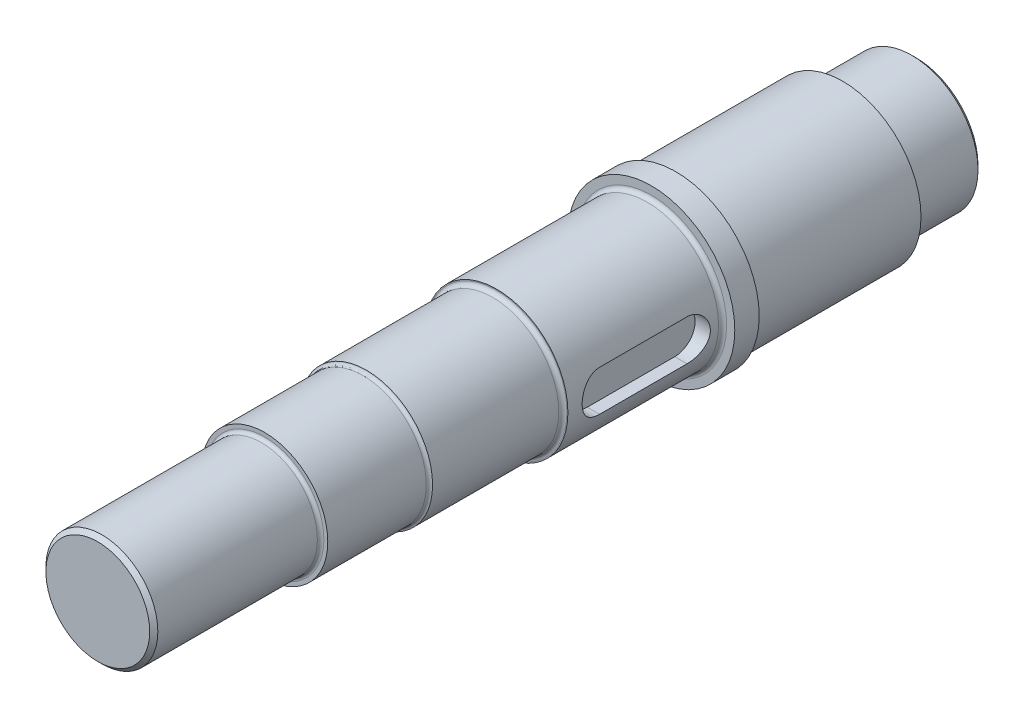
ISO-10303-21;
HEADER;
FILE_DESCRIPTION(('STEP AP214'),'2;1');
FILE_NAME('part.step','',(''),(''),'','','');
FILE_SCHEMA(('AUTOMOTIVE_DESIGN { 1 0 10303 214 1 1 1 1 }'));
ENDSEC;
DATA;
#1=APPLICATION_CONTEXT('core data for automotive mechanical design processes');
#2=APPLICATION_PROTOCOL_DEFINITION('international standard','automotive_design',2000,#1);
#3=PRODUCT_CONTEXT('',#1,'mechanical');
#4=PRODUCT('Part','Part','',(#3));
#5=PRODUCT_RELATED_PRODUCT_CATEGORY('part','',(#4));
#6=PRODUCT_DEFINITION_FORMATION('','',#4);
#7=PRODUCT_DEFINITION_CONTEXT('part definition',#1,'design');
#8=PRODUCT_DEFINITION('design','',#6,#7);
#9=PRODUCT_DEFINITION_SHAPE('','',#8);
#10=(LENGTH_UNIT() NAMED_UNIT(*) SI_UNIT(.MILLI.,.METRE.));
#11=(NAMED_UNIT(*) PLANE_ANGLE_UNIT() SI_UNIT($,.RADIAN.));
#12=(NAMED_UNIT(*) SI_UNIT($,.STERADIAN.) SOLID_ANGLE_UNIT());
#13=UNCERTAINTY_MEASURE_WITH_UNIT(LENGTH_MEASURE(1.E-05),#10,'distance_accuracy_value','');
#14=(GEOMETRIC_REPRESENTATION_CONTEXT(3) GLOBAL_UNCERTAINTY_ASSIGNED_CONTEXT((#13)) GLOBAL_UNIT_ASSIGNED_CONTEXT((#10,
#11,#12)) REPRESENTATION_CONTEXT('',''));
#15=CARTESIAN_POINT('',(0.,0.,0.));
#16=DIRECTION('',(0.,0.,1.));
#17=DIRECTION('',(1.,0.,0.));
#18=AXIS2_PLACEMENT_3D('',#15,#16,#17);
#19=CARTESIAN_POINT('',(0.,0.,206.));
#20=DIRECTION('',(0.,0.,-1.));
#21=DIRECTION('',(-1.,0.,0.));
#22=AXIS2_PLACEMENT_3D('',#19,#20,#21);
#23=CYLINDRICAL_SURFACE('',#22,35.);
#24=CARTESIAN_POINT('',(0.,0.,206.));
#25=DIRECTION('',(0.,0.,1.));
#26=DIRECTION('',(1.,0.,0.));
#27=AXIS2_PLACEMENT_3D('',#24,#25,#26);
#28=CIRCLE('',#27,35.);
#29=CARTESIAN_POINT('',(35.,0.,206.));
#30=VERTEX_POINT('',#29);
#31=EDGE_CURVE('E113',#30,#30,#28,.T.);
#32=ORIENTED_EDGE('',*,*,#31,.F.);
#33=EDGE_LOOP('',(#32));
#34=FACE_BOUND('',#33,.T.);
#35=CARTESIAN_POINT('',(0.,0.,132.));
#36=DIRECTION('',(0.,0.,1.));
#37=DIRECTION('',(1.,0.,0.));
#38=AXIS2_PLACEMENT_3D('',#35,#36,#37);
#39=CIRCLE('',#38,35.);
#40=CARTESIAN_POINT('',(35.,0.,132.));
#41=VERTEX_POINT('',#40);
#42=EDGE_CURVE('E137',#41,#41,#39,.T.);
#43=ORIENTED_EDGE('',*,*,#42,.T.);
#44=EDGE_LOOP('',(#43));
#45=FACE_BOUND('',#44,.T.);
#46=CARTESIAN_POINT('',(33.5410196624969,10.,189.));
#47=CARTESIAN_POINT('',(33.54098247272,10.0000365360893,189.275087218991));
#48=CARTESIAN_POINT('',(33.5444026068777,9.98865070675198,189.550161086631));
#49=CARTESIAN_POINT('',(33.55788623849,9.94330432826118,190.098222536011));
#50=CARTESIAN_POINT('',(33.5679483583608,9.90934846024636,190.371210538497));
#51=CARTESIAN_POINT('',(33.594413604027,9.81923831824626,190.912516593966));
#52=CARTESIAN_POINT('',(33.6108017015027,9.76313664788186,191.180844151566));
#53=CARTESIAN_POINT('',(33.6494095200446,9.62923263708805,191.711600382103));
#54=CARTESIAN_POINT('',(33.6716293712015,9.55142981256278,191.974028923308));
#55=CARTESIAN_POINT('',(33.7212290569955,9.37481209906698,192.49105940669));
#56=CARTESIAN_POINT('',(33.7486062865157,9.27600781522333,192.745665225122));
#57=CARTESIAN_POINT('',(33.8077446180219,9.05809844793719,193.245614243321));
#58=CARTESIAN_POINT('',(33.8395073431819,8.93898584406153,193.490953970474));
#59=CARTESIAN_POINT('',(33.9065191207983,8.68134043949088,193.970763720506));
#60=CARTESIAN_POINT('',(33.9417687454718,8.54280444976227,194.205231950015));
#61=CARTESIAN_POINT('',(34.0147841313154,8.24727956170075,194.661831999763));
#62=CARTESIAN_POINT('',(34.0525500209621,8.09028972082816,194.883963189026));
#63=CARTESIAN_POINT('',(34.1305798802948,7.75460900510779,195.320103075119));
#64=CARTESIAN_POINT('',(34.17088316088,7.5754627690098,195.533754390697));
#65=CARTESIAN_POINT('',(34.2519587918208,7.20001350476826,195.945314601006));
#66=CARTESIAN_POINT('',(34.2927311488189,7.00371023340689,196.143223272493));
#67=CARTESIAN_POINT('',(34.3736408909465,6.59516291750775,196.522063940254));
#68=CARTESIAN_POINT('',(34.4137781606715,6.38291601516098,196.702992879867));
#69=CARTESIAN_POINT('',(34.4923217776482,5.94385936590823,197.046629614172));
#70=CARTESIAN_POINT('',(34.5307281739127,5.71705003180523,197.209337925007));
#71=CARTESIAN_POINT('',(34.6054699464445,5.24589340555308,197.518300842206));
#72=CARTESIAN_POINT('',(34.6417525803369,5.00129596788592,197.664187116516));
#73=CARTESIAN_POINT('',(34.7104015648878,4.50021525068414,197.934712979143));
#74=CARTESIAN_POINT('',(34.7427694321742,4.24373662766712,198.059360803192));
#75=CARTESIAN_POINT('',(34.8026802322956,3.72058575986786,198.286471663879));
#76=CARTESIAN_POINT('',(34.8302231298386,3.45391344054173,198.388934538248));
#77=CARTESIAN_POINT('',(34.8796844486166,2.91230878338614,198.570791583086));
#78=CARTESIAN_POINT('',(34.9016030433665,2.63737670067014,198.650186465233));
#79=CARTESIAN_POINT('',(34.9386824573288,2.088570177379,198.783430843011));
#80=CARTESIAN_POINT('',(34.9540046534084,1.81485525332597,198.837892722128));
#81=CARTESIAN_POINT('',(34.9782725964626,1.26355320682489,198.923772221713));
#82=CARTESIAN_POINT('',(34.9872184437524,0.985966145364847,198.955190204717));
#83=CARTESIAN_POINT('',(34.9984783115281,0.429042577413919,198.994690755232));
#84=CARTESIAN_POINT('',(35.0007932895185,0.149706329346243,199.002776691916));
#85=CARTESIAN_POINT('',(34.99872781944,-0.408635888537315,198.995547124931));
#86=CARTESIAN_POINT('',(34.9943474819159,-0.68764186373014,198.98023200763));
#87=CARTESIAN_POINT('',(34.979239676817,-1.23515924205468,198.927125950851));
#88=CARTESIAN_POINT('',(34.9686997350484,-1.503740537151,198.889998894474));
#89=CARTESIAN_POINT('',(34.9417087498089,-2.03670936087621,198.794137218641));
#90=CARTESIAN_POINT('',(34.9252578403383,-2.30109698443278,198.735403089012));
#91=CARTESIAN_POINT('',(34.8868841581542,-2.82382541600096,198.596828297775));
#92=CARTESIAN_POINT('',(34.8649622424429,-3.08216716413865,198.516990941752));
#93=CARTESIAN_POINT('',(34.8162103963017,-3.59122625345115,198.336810274628));
#94=CARTESIAN_POINT('',(34.7893785934989,-3.84194064326846,198.236459138933));
#95=CARTESIAN_POINT('',(34.7312018919979,-4.33662254761107,198.014872653335));
#96=CARTESIAN_POINT('',(34.6998125025795,-4.58049139181082,197.893428790896));
#97=CARTESIAN_POINT('',(34.6335400843056,-5.05725829801619,197.631233286698));
#98=CARTESIAN_POINT('',(34.5986555043474,-5.29015142117991,197.490473062352));
#99=CARTESIAN_POINT('',(34.5262997215508,-5.74345927995586,197.190637059534));
#100=CARTESIAN_POINT('',(34.4888281020536,-5.96387199506769,197.031558327985));
#101=CARTESIAN_POINT('',(34.4122822535693,-6.39076242941755,196.696219908203));
#102=CARTESIAN_POINT('',(34.373208687104,-6.59724581781993,196.519967281927));
#103=CARTESIAN_POINT('',(34.2930504133064,-7.00219950736256,196.144792481781));
#104=CARTESIAN_POINT('',(34.2519435020112,-7.20012664060529,195.945288342202));
#105=CARTESIAN_POINT('',(34.1702230234806,-7.57847708088307,195.530351607355));
#106=CARTESIAN_POINT('',(34.1296092995715,-7.75890608103359,195.31492423327));
#107=CARTESIAN_POINT('',(34.0499816296953,-8.10121311351377,194.869353305942));
#108=CARTESIAN_POINT('',(34.0109684596198,-8.26308221533719,194.639202750601));
#109=CARTESIAN_POINT('',(33.935682173311,-8.56702972033077,194.165765191648));
#110=CARTESIAN_POINT('',(33.8994089741285,-8.7091087227312,193.922478586095));
#111=CARTESIAN_POINT('',(33.8303722143045,-8.9735591116493,193.422213172047));
#112=CARTESIAN_POINT('',(33.7976414958782,-9.09575063013379,193.165134658013));
#113=CARTESIAN_POINT('',(33.7370601860415,-9.31794179575968,192.641012358617));
#114=CARTESIAN_POINT('',(33.7092093502798,-9.41794255412979,192.373969073036));
#115=CARTESIAN_POINT('',(33.6592997079518,-9.59478968632395,191.832157970268));
#116=CARTESIAN_POINT('',(33.6372338320702,-9.67166433773742,191.557400039603));
#117=CARTESIAN_POINT('',(33.5995731264667,-9.80169669852145,191.002008910573));
#118=CARTESIAN_POINT('',(33.5839752989599,-9.85486539589321,190.721378497459));
#119=CARTESIAN_POINT('',(33.5616603042316,-9.93057481078496,190.200669771156));
#120=CARTESIAN_POINT('',(33.553933788227,-9.95661201264007,189.961136740334));
#121=CARTESIAN_POINT('',(33.5436069779552,-9.99132081128702,189.481075410578));
#122=CARTESIAN_POINT('',(33.5409988653378,-10.0000188938676,189.240549192864));
#123=CARTESIAN_POINT('',(33.5410196624969,-10.,189.));
#124=B_SPLINE_CURVE_WITH_KNOTS('',3,(#46,#47,#48,#49,#50,#51,#52,#53,#54,#55,#56,#57,#58,#59,
#60,#61,#62,#63,#64,#65,#66,#67,#68,#69,#70,#71,#72,#73,#74,#75,#76,#77,#78,#79,#80,#81,#82,#83,
#84,#85,#86,#87,#88,#89,#90,#91,#92,#93,#94,#95,#96,#97,#98,#99,#100,#101,#102,#103,#104,#105,
#106,#107,#108,#109,#110,#111,#112,#113,#114,#115,#116,#117,#118,#119,#120,#121,#122,#123),
.UNSPECIFIED.,.F.,.F.,(4,2,2,2,2,2,2,2,2,2,2,2,2,2,2,2,2,2,2,2,2,2,2,2,2,2,2,2,2,2,2,2,2,2,2,2,
2,2,4),(0.,0.824984357624054,1.64979766274564,2.47266343965469,3.29554757401041,
4.11801715879569,4.94079197884898,5.76370204493683,6.58665415984561,7.43083682322432,
8.27503145566179,9.11937776812351,9.96370015635821,10.8239516934824,11.6838688839443,
12.5437923639629,13.4036893113833,14.2411536565694,15.0786048261527,15.9159350607945,
16.7532514706184,17.5663142232641,18.379358545133,19.1922755880901,20.0055032833981,
20.8272825171044,21.6494280707064,22.4717063462234,23.2936479140539,24.1447133665264,
24.995500984547,25.8466962750067,26.6978657862674,27.5563505279373,28.4147922702562,
29.2721800407936,30.1291699873618,30.8517080106868,31.5731414970245),.UNSPECIFIED.);
#125=CARTESIAN_POINT('',(33.5410196624969,10.,189.));
#126=VERTEX_POINT('',#125);
#127=CARTESIAN_POINT('',(33.5410196624969,-10.,189.));
#128=VERTEX_POINT('',#127);
#129=EDGE_CURVE('E11',#126,#128,#124,.T.);
#130=ORIENTED_EDGE('',*,*,#129,.F.);
#131=DIRECTION('',(0.,0.,-1.));
#132=VECTOR('',#131,1.);
#133=CARTESIAN_POINT('',(33.5410196624969,10.,206.));
#134=LINE('',#133,#132);
#135=CARTESIAN_POINT('',(33.5410196624969,10.,146.));
#136=VERTEX_POINT('',#135);
#137=EDGE_CURVE('E164',#136,#126,#134,.F.);
#138=ORIENTED_EDGE('',*,*,#137,.F.);
#139=CARTESIAN_POINT('',(33.5410196624969,-10.,146.));
#140=CARTESIAN_POINT('',(33.54098247272,-10.0000365360893,145.724912781009));
#141=CARTESIAN_POINT('',(33.5444026068777,-9.98865070675197,145.449838913369));
#142=CARTESIAN_POINT('',(33.55788623849,-9.94330432826118,144.901777463989));
#143=CARTESIAN_POINT('',(33.5679483583608,-9.90934846024636,144.628789461503));
#144=CARTESIAN_POINT('',(33.594413604027,-9.81923831824626,144.087483406035));
#145=CARTESIAN_POINT('',(33.6108017015027,-9.76313664788186,143.819155848434));
#146=CARTESIAN_POINT('',(33.6494095200446,-9.62923263708805,143.288399617897));
#147=CARTESIAN_POINT('',(33.6716293712015,-9.55142981256278,143.025971076692));
#148=CARTESIAN_POINT('',(33.7212290569955,-9.37481209906698,142.50894059331));
#149=CARTESIAN_POINT('',(33.7486062865157,-9.27600781522333,142.254334774878));
#150=CARTESIAN_POINT('',(33.8077446180219,-9.05809844793719,141.754385756679));
#151=CARTESIAN_POINT('',(33.8395073431819,-8.93898584406153,141.509046029526));
#152=CARTESIAN_POINT('',(33.9065191207983,-8.68134043949088,141.029236279494));
#153=CARTESIAN_POINT('',(33.9417687454718,-8.54280444976227,140.794768049985));
#154=CARTESIAN_POINT('',(34.0147841313154,-8.24727956170075,140.338168000237));
#155=CARTESIAN_POINT('',(34.0525500209621,-8.09028972082816,140.116036810974));
#156=CARTESIAN_POINT('',(34.1305798802948,-7.75460900510778,139.679896924881));
#157=CARTESIAN_POINT('',(34.17088316088,-7.57546276900979,139.466245609303));
#158=CARTESIAN_POINT('',(34.2519587918208,-7.20001350476824,139.054685398994));
#159=CARTESIAN_POINT('',(34.2927311488189,-7.00371023340688,138.856776727507));
#160=CARTESIAN_POINT('',(34.3736408909465,-6.59516291750773,138.477936059746));
#161=CARTESIAN_POINT('',(34.4137781606715,-6.38291601516096,138.297007120133));
#162=CARTESIAN_POINT('',(34.4923217776482,-5.94385936590821,137.953370385828));
#163=CARTESIAN_POINT('',(34.5307281739127,-5.71705003180522,137.790662074993));
#164=CARTESIAN_POINT('',(34.6054699464445,-5.24589340555307,137.481699157794));
#165=CARTESIAN_POINT('',(34.6417525803369,-5.00129596788592,137.335812883484));
#166=CARTESIAN_POINT('',(34.7104015648878,-4.50021525068414,137.065287020857));
#167=CARTESIAN_POINT('',(34.7427694321742,-4.24373662766712,136.940639196808));
#168=CARTESIAN_POINT('',(34.8026802322956,-3.72058575986785,136.713528336121));
#169=CARTESIAN_POINT('',(34.8302231298386,-3.45391344054172,136.611065461752));
#170=CARTESIAN_POINT('',(34.8796844486166,-2.91230878338613,136.429208416914));
#171=CARTESIAN_POINT('',(34.9016030433665,-2.63737670067013,136.349813534767));
#172=CARTESIAN_POINT('',(34.9386824573288,-2.088570177379,136.21656915699));
#173=CARTESIAN_POINT('',(34.9540046534084,-1.81485525332597,136.162107277872));
#174=CARTESIAN_POINT('',(34.9782725964626,-1.26355320682489,136.076227778287));
#175=CARTESIAN_POINT('',(34.9872184437524,-0.985966145364847,136.044809795283));
#176=CARTESIAN_POINT('',(34.9984783115281,-0.429042577413922,136.005309244768));
#177=CARTESIAN_POINT('',(35.0007932895185,-0.149706329346246,135.997223308084));
#178=CARTESIAN_POINT('',(34.99872781944,0.408635888537311,136.004452875069));
#179=CARTESIAN_POINT('',(34.9943474819159,0.687641863730135,136.01976799237));
#180=CARTESIAN_POINT('',(34.979239676817,1.23515924205468,136.072874049149));
#181=CARTESIAN_POINT('',(34.9686997350484,1.503740537151,136.110001105526));
#182=CARTESIAN_POINT('',(34.9417087498089,2.03670936087621,136.205862781359));
#183=CARTESIAN_POINT('',(34.9252578403383,2.30109698443278,136.264596910988));
#184=CARTESIAN_POINT('',(34.8868841581542,2.82382541600096,136.403171702225));
#185=CARTESIAN_POINT('',(34.8649622424429,3.08216716413866,136.483009058248));
#186=CARTESIAN_POINT('',(34.8162103963017,3.59122625345116,136.663189725372));
#187=CARTESIAN_POINT('',(34.7893785934989,3.84194064326847,136.763540861067));
#188=CARTESIAN_POINT('',(34.7312018919979,4.33662254761108,136.985127346665));
#189=CARTESIAN_POINT('',(34.6998125025795,4.58049139181084,137.106571209104));
#190=CARTESIAN_POINT('',(34.6335400843056,5.05725829801621,137.368766713302));
#191=CARTESIAN_POINT('',(34.5986555043474,5.29015142117993,137.509526937648));
#192=CARTESIAN_POINT('',(34.5262997215507,5.74345927995587,137.809362940466));
#193=CARTESIAN_POINT('',(34.4888281020536,5.9638719950677,137.968441672015));
#194=CARTESIAN_POINT('',(34.4122822535693,6.39076242941756,138.303780091797));
#195=CARTESIAN_POINT('',(34.373208687104,6.59724581781994,138.480032718073));
#196=CARTESIAN_POINT('',(34.2930504133064,7.00219950736255,138.855207518219));
#197=CARTESIAN_POINT('',(34.2519435020112,7.20012664060526,139.054711657798));
#198=CARTESIAN_POINT('',(34.1702230234806,7.57847708088303,139.469648392645));
#199=CARTESIAN_POINT('',(34.1296092995716,7.75890608103355,139.68507576673));
#200=CARTESIAN_POINT('',(34.0499816296953,8.10121311351374,140.130646694058));
#201=CARTESIAN_POINT('',(34.0109684596198,8.26308221533716,140.360797249399));
#202=CARTESIAN_POINT('',(33.935682173311,8.56702972033075,140.834234808352));
#203=CARTESIAN_POINT('',(33.8994089741285,8.70910872273119,141.077521413905));
#204=CARTESIAN_POINT('',(33.8303722143045,8.97355911164931,141.577786827954));
#205=CARTESIAN_POINT('',(33.7976414958782,9.0957506301338,141.834865341987));
#206=CARTESIAN_POINT('',(33.7370601860415,9.31794179575968,142.358987641383));
#207=CARTESIAN_POINT('',(33.7092093502798,9.41794255412979,142.626030926964));
#208=CARTESIAN_POINT('',(33.6592997079518,9.59478968632395,143.167842029732));
#209=CARTESIAN_POINT('',(33.6372338320702,9.67166433773741,143.442599960397));
#210=CARTESIAN_POINT('',(33.5995731264667,9.80169669852145,143.997991089427));
#211=CARTESIAN_POINT('',(33.5839752989599,9.85486539589321,144.278621502541));
#212=CARTESIAN_POINT('',(33.5616603042316,9.93057481078496,144.799330228844));
#213=CARTESIAN_POINT('',(33.553933788227,9.95661201264007,145.038863259666));
#214=CARTESIAN_POINT('',(33.5436069779552,9.99132081128702,145.518924589422));
#215=CARTESIAN_POINT('',(33.5409988653378,10.0000188938676,145.759450807136));
#216=CARTESIAN_POINT('',(33.5410196624969,10.,146.));
#217=B_SPLINE_CURVE_WITH_KNOTS('',3,(#139,#140,#141,#142,#143,#144,#145,#146,#147,#148,#149,
#150,#151,#152,#153,#154,#155,#156,#157,#158,#159,#160,#161,#162,#163,#164,#165,#166,#167,#168,
#169,#170,#171,#172,#173,#174,#175,#176,#177,#178,#179,#180,#181,#182,#183,#184,#185,#186,#187,
#188,#189,#190,#191,#192,#193,#194,#195,#196,#197,#198,#199,#200,#201,#202,#203,#204,#205,#206,
#207,#208,#209,#210,#211,#212,#213,#214,#215,#216),.UNSPECIFIED.,.F.,.F.,(4,2,2,2,2,2,2,2,2,2,2,
2,2,2,2,2,2,2,2,2,2,2,2,2,2,2,2,2,2,2,2,2,2,2,2,2,2,2,4),(0.,0.824984357624054,1.64979766274564,
2.47266343965472,3.29554757401041,4.11801715879569,4.94079197884898,5.76370204493683,
6.58665415984561,7.43083682322433,8.2750314556618,9.11937776812355,9.96370015635821,
10.8239516934824,11.6838688839443,12.5437923639629,13.4036893113833,14.2411536565694,
15.0786048261527,15.9159350607945,16.7532514706184,17.5663142232641,18.379358545133,
19.1922755880901,20.0055032833981,20.8272825171044,21.6494280707064,22.4717063462234,
23.2936479140539,24.1447133665263,24.995500984547,25.8466962750067,26.6978657862674,
27.5563505279373,28.4147922702562,29.2721800407936,30.1291699873618,30.8517080106868,
31.5731414970245),.UNSPECIFIED.);
#218=CARTESIAN_POINT('',(33.5410196624969,-10.,146.));
#219=VERTEX_POINT('',#218);
#220=EDGE_CURVE('E166',#219,#136,#217,.T.);
#221=ORIENTED_EDGE('',*,*,#220,.F.);
#222=DIRECTION('',(0.,0.,-1.));
#223=VECTOR('',#222,1.);
#224=CARTESIAN_POINT('',(33.5410196624969,-10.,206.));
#225=LINE('',#224,#223);
#226=EDGE_CURVE('E48',#128,#219,#225,.T.);
#227=ORIENTED_EDGE('',*,*,#226,.F.);
#228=EDGE_LOOP('',(#130,#138,#221,#227));
#229=FACE_BOUND('',#228,.T.);
#230=ADVANCED_FACE('F35',(#34,#45,#229),#23,.T.);
#231=CARTESIAN_POINT('',(0.,0.,320.));
#232=DIRECTION('',(0.,0.,1.));
#233=DIRECTION('',(1.,0.,0.));
#234=AXIS2_PLACEMENT_3D('',#231,#232,#233);
#235=PLANE('',#234);
#236=CARTESIAN_POINT('',(0.,0.,320.));
#237=DIRECTION('',(0.,0.,1.));
#238=DIRECTION('',(1.,0.,0.));
#239=AXIS2_PLACEMENT_3D('',#236,#237,#238);
#240=CIRCLE('',#239,29.1);
#241=CARTESIAN_POINT('',(29.1,0.,320.));
#242=VERTEX_POINT('',#241);
#243=EDGE_CURVE('E146',#242,#242,#240,.F.);
#244=ORIENTED_EDGE('',*,*,#243,.T.);
#245=EDGE_LOOP('',(#244));
#246=FACE_BOUND('',#245,.T.);
#247=CARTESIAN_POINT('',(0.,0.,320.));
#248=DIRECTION('',(0.,0.,1.));
#249=DIRECTION('',(1.,0.,0.));
#250=AXIS2_PLACEMENT_3D('',#247,#248,#249);
#251=CIRCLE('',#250,31.);
#252=CARTESIAN_POINT('',(31.,0.,320.));
#253=VERTEX_POINT('',#252);
#254=EDGE_CURVE('E85',#253,#253,#251,.T.);
#255=ORIENTED_EDGE('',*,*,#254,.T.);
#256=EDGE_LOOP('',(#255));
#257=FACE_BOUND('',#256,.T.);
#258=ADVANCED_FACE('F196',(#246,#257),#235,.T.);
#259=CARTESIAN_POINT('',(0.,0.,206.));
#260=DIRECTION('',(0.,0.,1.));
#261=DIRECTION('',(1.,0.,0.));
#262=AXIS2_PLACEMENT_3D('',#259,#260,#261);
#263=PLANE('',#262);
#264=CARTESIAN_POINT('',(0.,0.,206.));
#265=DIRECTION('',(0.,0.,1.));
#266=DIRECTION('',(1.,0.,0.));
#267=AXIS2_PLACEMENT_3D('',#264,#265,#266);
#268=CIRCLE('',#267,34.5);
#269=CARTESIAN_POINT('',(34.5,0.,206.));
#270=VERTEX_POINT('',#269);
#271=EDGE_CURVE('E134',#270,#270,#268,.F.);
#272=ORIENTED_EDGE('',*,*,#271,.T.);
#273=EDGE_LOOP('',(#272));
#274=FACE_BOUND('',#273,.T.);
#275=ORIENTED_EDGE('',*,*,#31,.T.);
#276=EDGE_LOOP('',(#275));
#277=FACE_BOUND('',#276,.T.);
#278=ADVANCED_FACE('F199',(#274,#277),#263,.T.);
#279=CARTESIAN_POINT('',(0.,0.,130.));
#280=DIRECTION('',(0.,0.,1.));
#281=DIRECTION('',(1.,0.,0.));
#282=AXIS2_PLACEMENT_3D('',#279,#280,#281);
#283=PLANE('',#282);
#284=CARTESIAN_POINT('',(0.,0.,130.));
#285=DIRECTION('',(0.,0.,1.));
#286=DIRECTION('',(1.,0.,0.));
#287=AXIS2_PLACEMENT_3D('',#284,#285,#286);
#288=CIRCLE('',#287,37.);
#289=CARTESIAN_POINT('',(37.,0.,130.));
#290=VERTEX_POINT('',#289);
#291=EDGE_CURVE('E140',#290,#290,#288,.F.);
#292=ORIENTED_EDGE('',*,*,#291,.T.);
#293=EDGE_LOOP('',(#292));
#294=FACE_BOUND('',#293,.T.);
#295=CARTESIAN_POINT('',(0.,0.,130.));
#296=DIRECTION('',(0.,0.,1.));
#297=DIRECTION('',(1.,0.,0.));
#298=AXIS2_PLACEMENT_3D('',#295,#296,#297);
#299=CIRCLE('',#298,41.);
#300=CARTESIAN_POINT('',(41.,0.,130.));
#301=VERTEX_POINT('',#300);
#302=EDGE_CURVE('E117',#301,#301,#299,.T.);
#303=ORIENTED_EDGE('',*,*,#302,.T.);
#304=EDGE_LOOP('',(#303));
#305=FACE_BOUND('',#304,.T.);
#306=ADVANCED_FACE('F209',(#294,#305),#283,.T.);
#307=CARTESIAN_POINT('',(0.,0.,36.));
#308=DIRECTION('',(0.,0.,-1.));
#309=DIRECTION('',(-1.,0.,0.));
#310=AXIS2_PLACEMENT_3D('',#307,#308,#309);
#311=CYLINDRICAL_SURFACE('',#310,32.5);
#312=CARTESIAN_POINT('',(0.,0.,1.99999999999993));
#313=DIRECTION('',(0.,0.,1.));
#314=DIRECTION('',(1.,0.,0.));
#315=AXIS2_PLACEMENT_3D('',#312,#313,#314);
#316=CIRCLE('',#315,32.5);
#317=CARTESIAN_POINT('',(32.5,0.,1.99999999999993));
#318=VERTEX_POINT('',#317);
#319=EDGE_CURVE('E152',#318,#318,#316,.T.);
#320=ORIENTED_EDGE('',*,*,#319,.T.);
#321=EDGE_LOOP('',(#320));
#322=FACE_BOUND('',#321,.T.);
#323=CARTESIAN_POINT('',(0.,0.,36.));
#324=DIRECTION('',(0.,0.,1.));
#325=DIRECTION('',(1.,0.,0.));
#326=AXIS2_PLACEMENT_3D('',#323,#324,#325);
#327=CIRCLE('',#326,32.5);
#328=CARTESIAN_POINT('',(32.5,0.,36.));
#329=VERTEX_POINT('',#328);
#330=EDGE_CURVE('E126',#329,#329,#327,.T.);
#331=ORIENTED_EDGE('',*,*,#330,.F.);
#332=EDGE_LOOP('',(#331));
#333=FACE_BOUND('',#332,.T.);
#334=ADVANCED_FACE('F215',(#322,#333),#311,.T.);
#335=CARTESIAN_POINT('',(0.,0.,0.));
#336=DIRECTION('',(0.,0.,1.));
#337=DIRECTION('',(1.,0.,0.));
#338=AXIS2_PLACEMENT_3D('',#335,#336,#337);
#339=PLANE('',#338);
#340=CARTESIAN_POINT('',(0.,0.,0.));
#341=DIRECTION('',(0.,0.,1.));
#342=DIRECTION('',(1.,0.,0.));
#343=AXIS2_PLACEMENT_3D('',#340,#341,#342);
#344=CIRCLE('',#343,30.5000000000001);
#345=CARTESIAN_POINT('',(30.5000000000001,0.,0.));
#346=VERTEX_POINT('',#345);
#347=EDGE_CURVE('E155',#346,#346,#344,.F.);
#348=ORIENTED_EDGE('',*,*,#347,.T.);
#349=EDGE_LOOP('',(#348));
#350=FACE_BOUND('',#349,.T.);
#351=ADVANCED_FACE('F363',(#350),#339,.F.);
#352=CARTESIAN_POINT('',(0.,0.,36.));
#353=DIRECTION('',(0.,0.,1.));
#354=DIRECTION('',(1.,0.,0.));
#355=AXIS2_PLACEMENT_3D('',#352,#353,#354);
#356=PLANE('',#355);
#357=CARTESIAN_POINT('',(0.,0.,36.));
#358=DIRECTION('',(0.,0.,1.));
#359=DIRECTION('',(1.,0.,0.));
#360=AXIS2_PLACEMENT_3D('',#357,#358,#359);
#361=CIRCLE('',#360,38.5);
#362=CARTESIAN_POINT('',(38.5,0.,36.));
#363=VERTEX_POINT('',#362);
#364=EDGE_CURVE('E120',#363,#363,#361,.T.);
#365=ORIENTED_EDGE('',*,*,#364,.F.);
#366=EDGE_LOOP('',(#365));
#367=FACE_BOUND('',#366,.T.);
#368=ORIENTED_EDGE('',*,*,#330,.T.);
#369=EDGE_LOOP('',(#368));
#370=FACE_BOUND('',#369,.T.);
#371=ADVANCED_FACE('F355',(#367,#370),#356,.F.);
#372=CARTESIAN_POINT('',(0.,0.,118.));
#373=DIRECTION('',(0.,0.,-1.));
#374=DIRECTION('',(-1.,0.,0.));
#375=AXIS2_PLACEMENT_3D('',#372,#373,#374);
#376=CYLINDRICAL_SURFACE('',#375,38.5);
#377=CARTESIAN_POINT('',(0.,0.,118.));
#378=DIRECTION('',(0.,0.,1.));
#379=DIRECTION('',(1.,0.,0.));
#380=AXIS2_PLACEMENT_3D('',#377,#378,#379);
#381=CIRCLE('',#380,38.5);
#382=CARTESIAN_POINT('',(38.5,0.,118.));
#383=VERTEX_POINT('',#382);
#384=EDGE_CURVE('E123',#383,#383,#381,.T.);
#385=ORIENTED_EDGE('',*,*,#384,.F.);
#386=EDGE_LOOP('',(#385));
#387=FACE_BOUND('',#386,.T.);
#388=ORIENTED_EDGE('',*,*,#364,.T.);
#389=EDGE_LOOP('',(#388));
#390=FACE_BOUND('',#389,.T.);
#391=ADVANCED_FACE('F347',(#387,#390),#376,.T.);
#392=CARTESIAN_POINT('',(0.,0.,118.));
#393=DIRECTION('',(0.,0.,1.));
#394=DIRECTION('',(1.,0.,0.));
#395=AXIS2_PLACEMENT_3D('',#392,#393,#394);
#396=PLANE('',#395);
#397=CARTESIAN_POINT('',(0.,0.,118.));
#398=DIRECTION('',(0.,0.,1.));
#399=DIRECTION('',(1.,0.,0.));
#400=AXIS2_PLACEMENT_3D('',#397,#398,#399);
#401=CIRCLE('',#400,41.);
#402=CARTESIAN_POINT('',(41.,0.,118.));
#403=VERTEX_POINT('',#402);
#404=EDGE_CURVE('E116',#403,#403,#401,.T.);
#405=ORIENTED_EDGE('',*,*,#404,.F.);
#406=EDGE_LOOP('',(#405));
#407=FACE_BOUND('',#406,.T.);
#408=ORIENTED_EDGE('',*,*,#384,.T.);
#409=EDGE_LOOP('',(#408));
#410=FACE_BOUND('',#409,.T.);
#411=ADVANCED_FACE('F339',(#407,#410),#396,.F.);
#412=CARTESIAN_POINT('',(0.,0.,130.));
#413=DIRECTION('',(0.,0.,-1.));
#414=DIRECTION('',(-1.,0.,0.));
#415=AXIS2_PLACEMENT_3D('',#412,#413,#414);
#416=CYLINDRICAL_SURFACE('',#415,41.);
#417=ORIENTED_EDGE('',*,*,#302,.F.);
#418=EDGE_LOOP('',(#417));
#419=FACE_BOUND('',#418,.T.);
#420=ORIENTED_EDGE('',*,*,#404,.T.);
#421=EDGE_LOOP('',(#420));
#422=FACE_BOUND('',#421,.T.);
#423=ADVANCED_FACE('F206',(#419,#422),#416,.T.);
#424=CARTESIAN_POINT('',(0.,0.,270.));
#425=DIRECTION('',(0.,0.,-1.));
#426=DIRECTION('',(-1.,0.,0.));
#427=AXIS2_PLACEMENT_3D('',#424,#425,#426);
#428=CYLINDRICAL_SURFACE('',#427,32.5);
#429=CARTESIAN_POINT('',(0.,0.,208.));
#430=DIRECTION('',(0.,0.,1.));
#431=DIRECTION('',(1.,0.,0.));
#432=AXIS2_PLACEMENT_3D('',#429,#430,#431);
#433=CIRCLE('',#432,32.5);
#434=CARTESIAN_POINT('',(32.5,0.,208.));
#435=VERTEX_POINT('',#434);
#436=EDGE_CURVE('E131',#435,#435,#433,.T.);
#437=ORIENTED_EDGE('',*,*,#436,.T.);
#438=EDGE_LOOP('',(#437));
#439=FACE_BOUND('',#438,.T.);
#440=CARTESIAN_POINT('',(0.,0.,270.));
#441=DIRECTION('',(0.,0.,1.));
#442=DIRECTION('',(1.,0.,0.));
#443=AXIS2_PLACEMENT_3D('',#440,#441,#442);
#444=CIRCLE('',#443,32.5);
#445=CARTESIAN_POINT('',(32.5,0.,270.));
#446=VERTEX_POINT('',#445);
#447=EDGE_CURVE('E110',#446,#446,#444,.T.);
#448=ORIENTED_EDGE('',*,*,#447,.F.);
#449=EDGE_LOOP('',(#448));
#450=FACE_BOUND('',#449,.T.);
#451=ADVANCED_FACE('F203',(#439,#450),#428,.T.);
#452=CARTESIAN_POINT('',(0.,0.,320.));
#453=DIRECTION('',(0.,0.,-1.));
#454=DIRECTION('',(-1.,0.,0.));
#455=AXIS2_PLACEMENT_3D('',#452,#453,#454);
#456=CYLINDRICAL_SURFACE('',#455,31.);
#457=CARTESIAN_POINT('',(0.,0.,271.596871942267));
#458=DIRECTION('',(0.,0.,-1.));
#459=DIRECTION('',(-1.,0.,0.));
#460=AXIS2_PLACEMENT_3D('',#457,#458,#459);
#461=CIRCLE('',#460,31.);
#462=CARTESIAN_POINT('',(-31.,0.,271.596871942267));
#463=VERTEX_POINT('',#462);
#464=EDGE_CURVE('E149',#463,#463,#461,.F.);
#465=ORIENTED_EDGE('',*,*,#464,.T.);
#466=EDGE_LOOP('',(#465));
#467=FACE_BOUND('',#466,.T.);
#468=ORIENTED_EDGE('',*,*,#254,.F.);
#469=EDGE_LOOP('',(#468));
#470=FACE_BOUND('',#469,.T.);
#471=ADVANCED_FACE('F194',(#467,#470),#456,.T.);
#472=CARTESIAN_POINT('',(0.,0.,402.));
#473=DIRECTION('',(0.,0.,-1.));
#474=DIRECTION('',(-1.,0.,0.));
#475=AXIS2_PLACEMENT_3D('',#472,#473,#474);
#476=CYLINDRICAL_SURFACE('',#475,27.5);
#477=CARTESIAN_POINT('',(0.,0.,400.));
#478=DIRECTION('',(0.,0.,1.));
#479=DIRECTION('',(1.,0.,0.));
#480=AXIS2_PLACEMENT_3D('',#477,#478,#479);
#481=CIRCLE('',#480,27.5);
#482=CARTESIAN_POINT('',(27.5,0.,400.));
#483=VERTEX_POINT('',#482);
#484=EDGE_CURVE('E161',#483,#483,#481,.F.);
#485=ORIENTED_EDGE('',*,*,#484,.T.);
#486=EDGE_LOOP('',(#485));
#487=FACE_BOUND('',#486,.T.);
#488=CARTESIAN_POINT('',(0.,0.,321.6));
#489=DIRECTION('',(0.,0.,1.));
#490=DIRECTION('',(1.,0.,0.));
#491=AXIS2_PLACEMENT_3D('',#488,#489,#490);
#492=CIRCLE('',#491,27.5);
#493=CARTESIAN_POINT('',(27.5,0.,321.6));
#494=VERTEX_POINT('',#493);
#495=EDGE_CURVE('E143',#494,#494,#492,.T.);
#496=ORIENTED_EDGE('',*,*,#495,.T.);
#497=EDGE_LOOP('',(#496));
#498=FACE_BOUND('',#497,.T.);
#499=ADVANCED_FACE('F190',(#487,#498),#476,.T.);
#500=CARTESIAN_POINT('',(0.,0.,402.));
#501=DIRECTION('',(0.,0.,1.));
#502=DIRECTION('',(1.,0.,0.));
#503=AXIS2_PLACEMENT_3D('',#500,#501,#502);
#504=PLANE('',#503);
#505=CARTESIAN_POINT('',(0.,0.,402.));
#506=DIRECTION('',(0.,0.,1.));
#507=DIRECTION('',(1.,0.,0.));
#508=AXIS2_PLACEMENT_3D('',#505,#506,#507);
#509=CIRCLE('',#508,25.5);
#510=CARTESIAN_POINT('',(25.5,0.,402.));
#511=VERTEX_POINT('',#510);
#512=EDGE_CURVE('E158',#511,#511,#509,.T.);
#513=ORIENTED_EDGE('',*,*,#512,.T.);
#514=EDGE_LOOP('',(#513));
#515=FACE_BOUND('',#514,.T.);
#516=ADVANCED_FACE('F186',(#515),#504,.T.);
#517=CARTESIAN_POINT('',(0.,0.,208.));
#518=DIRECTION('',(0.,0.,1.));
#519=DIRECTION('',(1.,0.,0.));
#520=AXIS2_PLACEMENT_3D('',#517,#518,#519);
#521=TOROIDAL_SURFACE('',#520,34.5,2.);
#522=ORIENTED_EDGE('',*,*,#271,.F.);
#523=EDGE_LOOP('',(#522));
#524=FACE_BOUND('',#523,.T.);
#525=ORIENTED_EDGE('',*,*,#436,.F.);
#526=EDGE_LOOP('',(#525));
#527=FACE_BOUND('',#526,.T.);
#528=ADVANCED_FACE('F189',(#524,#527),#521,.F.);
#529=CARTESIAN_POINT('',(0.,0.,132.));
#530=DIRECTION('',(0.,0.,1.));
#531=DIRECTION('',(1.,0.,0.));
#532=AXIS2_PLACEMENT_3D('',#529,#530,#531);
#533=TOROIDAL_SURFACE('',#532,37.,2.);
#534=ORIENTED_EDGE('',*,*,#291,.F.);
#535=EDGE_LOOP('',(#534));
#536=FACE_BOUND('',#535,.T.);
#537=ORIENTED_EDGE('',*,*,#42,.F.);
#538=EDGE_LOOP('',(#537));
#539=FACE_BOUND('',#538,.T.);
#540=ADVANCED_FACE('F291',(#536,#539),#533,.F.);
#541=CARTESIAN_POINT('',(0.,0.,321.6));
#542=DIRECTION('',(0.,0.,1.));
#543=DIRECTION('',(1.,0.,0.));
#544=AXIS2_PLACEMENT_3D('',#541,#542,#543);
#545=TOROIDAL_SURFACE('',#544,29.1,1.6);
#546=ORIENTED_EDGE('',*,*,#243,.F.);
#547=EDGE_LOOP('',(#546));
#548=FACE_BOUND('',#547,.T.);
#549=ORIENTED_EDGE('',*,*,#495,.F.);
#550=EDGE_LOOP('',(#549));
#551=FACE_BOUND('',#550,.T.);
#552=ADVANCED_FACE('F282',(#548,#551),#545,.F.);
#553=CARTESIAN_POINT('',(0.,0.,271.596871942267));
#554=DIRECTION('',(0.,0.,-1.));
#555=DIRECTION('',(-1.,0.,0.));
#556=AXIS2_PLACEMENT_3D('',#553,#554,#555);
#557=TOROIDAL_SURFACE('',#556,32.6,1.6);
#558=ORIENTED_EDGE('',*,*,#447,.T.);
#559=EDGE_LOOP('',(#558));
#560=FACE_BOUND('',#559,.T.);
#561=ORIENTED_EDGE('',*,*,#464,.F.);
#562=EDGE_LOOP('',(#561));
#563=FACE_BOUND('',#562,.T.);
#564=ADVANCED_FACE('F275',(#560,#563),#557,.F.);
#565=CARTESIAN_POINT('',(0.,0.,1.99999999999993));
#566=DIRECTION('',(0.,0.,1.));
#567=DIRECTION('',(1.,0.,0.));
#568=AXIS2_PLACEMENT_3D('',#565,#566,#567);
#569=CONICAL_SURFACE('',#568,32.5,0.785398163397447);
#570=ORIENTED_EDGE('',*,*,#347,.F.);
#571=EDGE_LOOP('',(#570));
#572=FACE_BOUND('',#571,.T.);
#573=ORIENTED_EDGE('',*,*,#319,.F.);
#574=EDGE_LOOP('',(#573));
#575=FACE_BOUND('',#574,.T.);
#576=ADVANCED_FACE('F269',(#572,#575),#569,.T.);
#577=CARTESIAN_POINT('',(0.,0.,402.));
#578=DIRECTION('',(0.,0.,-1.));
#579=DIRECTION('',(-1.,0.,0.));
#580=AXIS2_PLACEMENT_3D('',#577,#578,#579);
#581=CONICAL_SURFACE('',#580,25.5,0.785398163397456);
#582=ORIENTED_EDGE('',*,*,#484,.F.);
#583=EDGE_LOOP('',(#582));
#584=FACE_BOUND('',#583,.T.);
#585=ORIENTED_EDGE('',*,*,#512,.F.);
#586=EDGE_LOOP('',(#585));
#587=FACE_BOUND('',#586,.T.);
#588=ADVANCED_FACE('F37',(#584,#587),#581,.T.);
#589=CARTESIAN_POINT('',(56.5,0.,189.));
#590=DIRECTION('',(-1.,0.,0.));
#591=DIRECTION('',(0.,0.,1.));
#592=AXIS2_PLACEMENT_3D('',#589,#590,#591);
#593=CYLINDRICAL_SURFACE('',#592,10.);
#594=ORIENTED_EDGE('',*,*,#129,.T.);
#595=DIRECTION('',(-1.,0.,0.));
#596=VECTOR('',#595,1.);
#597=CARTESIAN_POINT('',(56.5,-10.,189.));
#598=LINE('',#597,#596);
#599=CARTESIAN_POINT('',(27.5,-10.,189.));
#600=VERTEX_POINT('',#599);
#601=EDGE_CURVE('E78',#128,#600,#598,.T.);
#602=ORIENTED_EDGE('',*,*,#601,.T.);
#603=CARTESIAN_POINT('',(27.5,0.,189.));
#604=DIRECTION('',(1.,0.,0.));
#605=DIRECTION('',(0.,0.,-1.));
#606=AXIS2_PLACEMENT_3D('',#603,#604,#605);
#607=CIRCLE('',#606,10.);
#608=CARTESIAN_POINT('',(27.5,10.,189.));
#609=VERTEX_POINT('',#608);
#610=EDGE_CURVE('E82',#609,#600,#607,.T.);
#611=ORIENTED_EDGE('',*,*,#610,.F.);
#612=DIRECTION('',(-1.,0.,0.));
#613=VECTOR('',#612,1.);
#614=CARTESIAN_POINT('',(56.5,10.,189.));
#615=LINE('',#614,#613);
#616=EDGE_CURVE('E104',#126,#609,#615,.T.);
#617=ORIENTED_EDGE('',*,*,#616,.F.);
#618=EDGE_LOOP('',(#594,#602,#611,#617));
#619=FACE_BOUND('',#618,.T.);
#620=ADVANCED_FACE('F80',(#619),#593,.F.);
#621=CARTESIAN_POINT('',(56.5,-10.,189.));
#622=DIRECTION('',(0.,1.,0.));
#623=DIRECTION('',(0.,0.,1.));
#624=AXIS2_PLACEMENT_3D('',#621,#622,#623);
#625=PLANE('',#624);
#626=ORIENTED_EDGE('',*,*,#226,.T.);
#627=DIRECTION('',(-1.,0.,0.));
#628=VECTOR('',#627,1.);
#629=CARTESIAN_POINT('',(56.5,-10.,146.));
#630=LINE('',#629,#628);
#631=CARTESIAN_POINT('',(27.5,-10.,146.));
#632=VERTEX_POINT('',#631);
#633=EDGE_CURVE('E86',#219,#632,#630,.T.);
#634=ORIENTED_EDGE('',*,*,#633,.T.);
#635=DIRECTION('',(0.,0.,-1.));
#636=VECTOR('',#635,1.);
#637=CARTESIAN_POINT('',(27.5,-10.,189.));
#638=LINE('',#637,#636);
#639=EDGE_CURVE('E89',#600,#632,#638,.T.);
#640=ORIENTED_EDGE('',*,*,#639,.F.);
#641=ORIENTED_EDGE('',*,*,#601,.F.);
#642=EDGE_LOOP('',(#626,#634,#640,#641));
#643=FACE_BOUND('',#642,.T.);
#644=ADVANCED_FACE('F90',(#643),#625,.T.);
#645=CARTESIAN_POINT('',(56.5,0.,146.));
#646=DIRECTION('',(-1.,0.,0.));
#647=DIRECTION('',(0.,0.,1.));
#648=AXIS2_PLACEMENT_3D('',#645,#646,#647);
#649=CYLINDRICAL_SURFACE('',#648,10.);
#650=ORIENTED_EDGE('',*,*,#220,.T.);
#651=DIRECTION('',(-1.,0.,0.));
#652=VECTOR('',#651,1.);
#653=CARTESIAN_POINT('',(56.5,10.,146.));
#654=LINE('',#653,#652);
#655=CARTESIAN_POINT('',(27.5,10.,146.));
#656=VERTEX_POINT('',#655);
#657=EDGE_CURVE('E55',#136,#656,#654,.T.);
#658=ORIENTED_EDGE('',*,*,#657,.T.);
#659=CARTESIAN_POINT('',(27.5,0.,146.));
#660=DIRECTION('',(1.,0.,0.));
#661=DIRECTION('',(0.,0.,-1.));
#662=AXIS2_PLACEMENT_3D('',#659,#660,#661);
#663=CIRCLE('',#662,10.);
#664=EDGE_CURVE('E95',#632,#656,#663,.T.);
#665=ORIENTED_EDGE('',*,*,#664,.F.);
#666=ORIENTED_EDGE('',*,*,#633,.F.);
#667=EDGE_LOOP('',(#650,#658,#665,#666));
#668=FACE_BOUND('',#667,.T.);
#669=ADVANCED_FACE('F174',(#668),#649,.F.);
#670=CARTESIAN_POINT('',(56.5,10.,189.));
#671=DIRECTION('',(0.,-1.,0.));
#672=DIRECTION('',(0.,0.,-1.));
#673=AXIS2_PLACEMENT_3D('',#670,#671,#672);
#674=PLANE('',#673);
#675=ORIENTED_EDGE('',*,*,#137,.T.);
#676=ORIENTED_EDGE('',*,*,#616,.T.);
#677=DIRECTION('',(0.,0.,1.));
#678=VECTOR('',#677,1.);
#679=CARTESIAN_POINT('',(27.5,10.,189.));
#680=LINE('',#679,#678);
#681=EDGE_CURVE('E99',#656,#609,#680,.T.);
#682=ORIENTED_EDGE('',*,*,#681,.F.);
#683=ORIENTED_EDGE('',*,*,#657,.F.);
#684=EDGE_LOOP('',(#675,#676,#682,#683));
#685=FACE_BOUND('',#684,.T.);
#686=ADVANCED_FACE('F179',(#685),#674,.T.);
#687=CARTESIAN_POINT('',(27.5,0.,189.));
#688=DIRECTION('',(1.,0.,0.));
#689=DIRECTION('',(0.,0.,-1.));
#690=AXIS2_PLACEMENT_3D('',#687,#688,#689);
#691=PLANE('',#690);
#692=ORIENTED_EDGE('',*,*,#610,.T.);
#693=ORIENTED_EDGE('',*,*,#639,.T.);
#694=ORIENTED_EDGE('',*,*,#664,.T.);
#695=ORIENTED_EDGE('',*,*,#681,.T.);
#696=EDGE_LOOP('',(#692,#693,#694,#695));
#697=FACE_BOUND('',#696,.T.);
#698=ADVANCED_FACE('F98',(#697),#691,.T.);
#699=CLOSED_SHELL('',(#230,#258,#278,#306,#334,#351,#371,#391,#411,#423,#451,#471,#499,#516,
#528,#540,#552,#564,#576,#588,#620,#644,#669,#686,#698));
#700=MANIFOLD_SOLID_BREP('B2',#699);
#701=ADVANCED_BREP_SHAPE_REPRESENTATION('',(#18,#700),#14);
#702=SHAPE_DEFINITION_REPRESENTATION(#9,#701);
ENDSEC;
END-ISO-10303-21;
